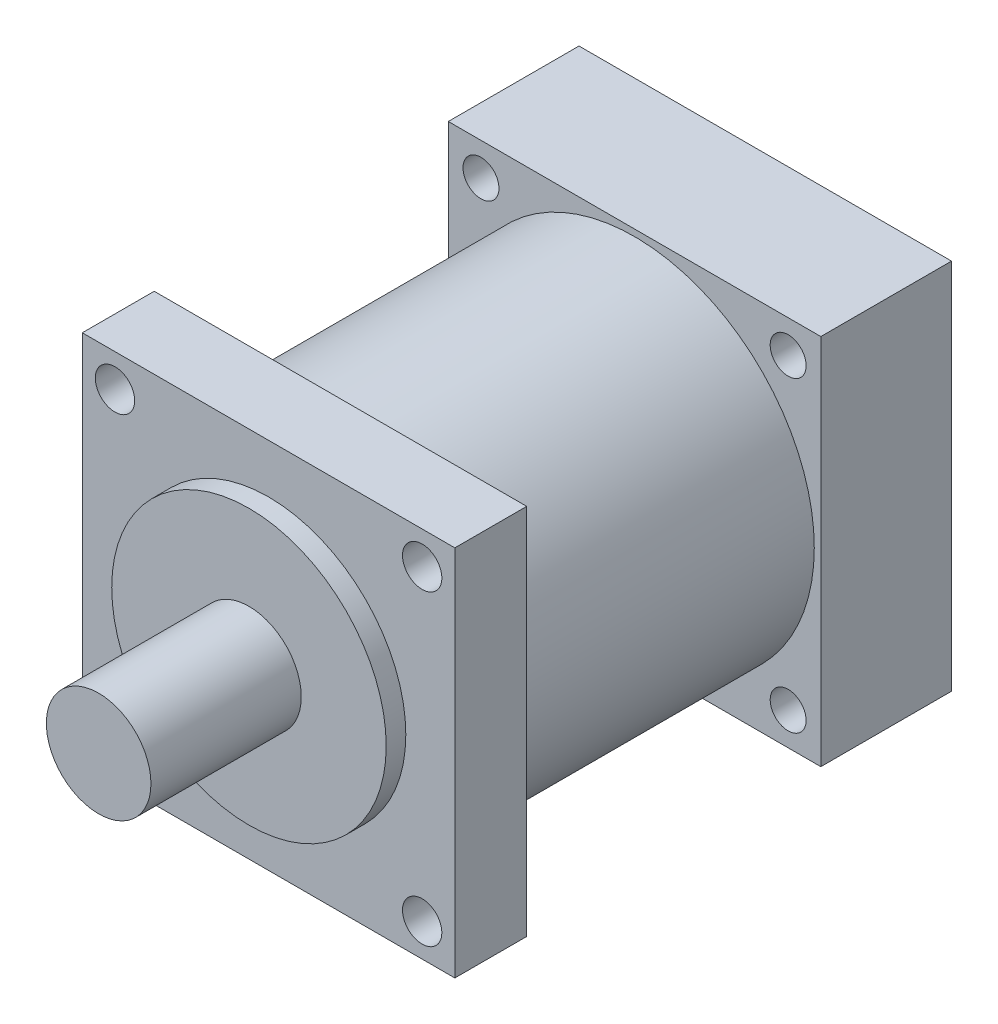
ISO-10303-21;
HEADER;
FILE_DESCRIPTION(('STEP AP214'),'2;1');
FILE_NAME('part.step','',(''),(''),'','','');
FILE_SCHEMA(('AUTOMOTIVE_DESIGN { 1 0 10303 214 1 1 1 1 }'));
ENDSEC;
DATA;
#1=APPLICATION_CONTEXT('core data for automotive mechanical design processes');
#2=APPLICATION_PROTOCOL_DEFINITION('international standard','automotive_design',2000,#1);
#3=PRODUCT_CONTEXT('',#1,'mechanical');
#4=PRODUCT('Part','Part','',(#3));
#5=PRODUCT_RELATED_PRODUCT_CATEGORY('part','',(#4));
#6=PRODUCT_DEFINITION_FORMATION('','',#4);
#7=PRODUCT_DEFINITION_CONTEXT('part definition',#1,'design');
#8=PRODUCT_DEFINITION('design','',#6,#7);
#9=PRODUCT_DEFINITION_SHAPE('','',#8);
#10=(LENGTH_UNIT() NAMED_UNIT(*) SI_UNIT(.MILLI.,.METRE.));
#11=(NAMED_UNIT(*) PLANE_ANGLE_UNIT() SI_UNIT($,.RADIAN.));
#12=(NAMED_UNIT(*) SI_UNIT($,.STERADIAN.) SOLID_ANGLE_UNIT());
#13=UNCERTAINTY_MEASURE_WITH_UNIT(LENGTH_MEASURE(1.E-05),#10,'distance_accuracy_value','');
#14=(GEOMETRIC_REPRESENTATION_CONTEXT(3) GLOBAL_UNCERTAINTY_ASSIGNED_CONTEXT((#13)) GLOBAL_UNIT_ASSIGNED_CONTEXT((#10,
#11,#12)) REPRESENTATION_CONTEXT('',''));
#15=CARTESIAN_POINT('',(0.,0.,0.));
#16=DIRECTION('',(0.,0.,1.));
#17=DIRECTION('',(1.,0.,0.));
#18=AXIS2_PLACEMENT_3D('',#15,#16,#17);
#19=CARTESIAN_POINT('',(0.,0.,11.));
#20=DIRECTION('',(0.,0.,1.));
#21=DIRECTION('',(1.,0.,0.));
#22=AXIS2_PLACEMENT_3D('',#19,#20,#21);
#23=PLANE('',#22);
#24=CARTESIAN_POINT('',(4.99675324675326,11.7516233766234,11.));
#25=DIRECTION('',(0.,0.,1.));
#26=DIRECTION('',(1.,0.,0.));
#27=AXIS2_PLACEMENT_3D('',#24,#25,#26);
#28=CIRCLE('',#27,21.);
#29=CARTESIAN_POINT('',(25.9967532467533,11.7516233766234,11.));
#30=VERTEX_POINT('',#29);
#31=EDGE_CURVE('E150',#30,#30,#28,.T.);
#32=ORIENTED_EDGE('',*,*,#31,.F.);
#33=EDGE_LOOP('',(#32));
#34=FACE_BOUND('',#33,.T.);
#35=CARTESIAN_POINT('',(-18.5032467532467,-11.7483766233766,11.));
#36=DIRECTION('',(0.,0.,1.));
#37=DIRECTION('',(-1.,0.,0.));
#38=AXIS2_PLACEMENT_3D('',#35,#36,#37);
#39=CIRCLE('',#38,3.0101369019199);
#40=CARTESIAN_POINT('',(-21.5133836551666,-11.7483766233766,11.));
#41=VERTEX_POINT('',#40);
#42=EDGE_CURVE('E165',#41,#41,#39,.T.);
#43=ORIENTED_EDGE('',*,*,#42,.F.);
#44=EDGE_LOOP('',(#43));
#45=FACE_BOUND('',#44,.T.);
#46=CARTESIAN_POINT('',(-18.5032467532467,35.2516233766234,11.));
#47=DIRECTION('',(0.,0.,1.));
#48=DIRECTION('',(1.,0.,0.));
#49=AXIS2_PLACEMENT_3D('',#46,#47,#48);
#50=CIRCLE('',#49,3.0101369019199);
#51=CARTESIAN_POINT('',(-15.4931098513268,35.2516233766234,11.));
#52=VERTEX_POINT('',#51);
#53=EDGE_CURVE('E177',#52,#52,#50,.T.);
#54=ORIENTED_EDGE('',*,*,#53,.F.);
#55=EDGE_LOOP('',(#54));
#56=FACE_BOUND('',#55,.T.);
#57=DIRECTION('',(0.,-1.,0.));
#58=VECTOR('',#57,1.);
#59=CARTESIAN_POINT('',(-23.5032467532468,40.2516233766234,11.));
#60=LINE('',#59,#58);
#61=CARTESIAN_POINT('',(-23.5032467532468,40.2516233766234,11.));
#62=VERTEX_POINT('',#61);
#63=CARTESIAN_POINT('',(-23.5032467532467,-16.7483766233766,11.));
#64=VERTEX_POINT('',#63);
#65=EDGE_CURVE('E183',#62,#64,#60,.T.);
#66=ORIENTED_EDGE('',*,*,#65,.T.);
#67=DIRECTION('',(1.,0.,0.));
#68=VECTOR('',#67,1.);
#69=CARTESIAN_POINT('',(-23.5032467532467,-16.7483766233766,11.));
#70=LINE('',#69,#68);
#71=CARTESIAN_POINT('',(33.4967532467533,-16.7483766233766,11.));
#72=VERTEX_POINT('',#71);
#73=EDGE_CURVE('E86',#64,#72,#70,.T.);
#74=ORIENTED_EDGE('',*,*,#73,.T.);
#75=DIRECTION('',(0.,1.,0.));
#76=VECTOR('',#75,1.);
#77=CARTESIAN_POINT('',(33.4967532467533,40.2516233766234,11.));
#78=LINE('',#77,#76);
#79=CARTESIAN_POINT('',(33.4967532467533,40.2516233766234,11.));
#80=VERTEX_POINT('',#79);
#81=EDGE_CURVE('E186',#72,#80,#78,.T.);
#82=ORIENTED_EDGE('',*,*,#81,.T.);
#83=DIRECTION('',(-1.,0.,0.));
#84=VECTOR('',#83,1.);
#85=CARTESIAN_POINT('',(-23.5032467532468,40.2516233766234,11.));
#86=LINE('',#85,#84);
#87=EDGE_CURVE('E54',#80,#62,#86,.T.);
#88=ORIENTED_EDGE('',*,*,#87,.T.);
#89=EDGE_LOOP('',(#66,#74,#82,#88));
#90=FACE_BOUND('',#89,.T.);
#91=CARTESIAN_POINT('',(28.4967532467533,35.2516233766234,11.));
#92=DIRECTION('',(0.,0.,1.));
#93=DIRECTION('',(-1.,0.,0.));
#94=AXIS2_PLACEMENT_3D('',#91,#92,#93);
#95=CIRCLE('',#94,3.01013690191991);
#96=CARTESIAN_POINT('',(25.4866163448333,35.2516233766234,11.));
#97=VERTEX_POINT('',#96);
#98=EDGE_CURVE('E171',#97,#97,#95,.T.);
#99=ORIENTED_EDGE('',*,*,#98,.F.);
#100=EDGE_LOOP('',(#99));
#101=FACE_BOUND('',#100,.T.);
#102=CARTESIAN_POINT('',(28.4967532467532,-11.7483766233766,11.));
#103=DIRECTION('',(0.,0.,1.));
#104=DIRECTION('',(1.,0.,0.));
#105=AXIS2_PLACEMENT_3D('',#102,#103,#104);
#106=CIRCLE('',#105,3.01013690191991);
#107=CARTESIAN_POINT('',(31.5068901486731,-11.7483766233766,11.));
#108=VERTEX_POINT('',#107);
#109=EDGE_CURVE('E159',#108,#108,#106,.T.);
#110=ORIENTED_EDGE('',*,*,#109,.F.);
#111=EDGE_LOOP('',(#110));
#112=FACE_BOUND('',#111,.T.);
#113=ADVANCED_FACE('F35',(#34,#45,#56,#90,#101,#112),#23,.T.);
#114=CARTESIAN_POINT('',(0.,0.,0.));
#115=DIRECTION('',(0.,0.,1.));
#116=DIRECTION('',(1.,0.,0.));
#117=AXIS2_PLACEMENT_3D('',#114,#115,#116);
#118=PLANE('',#117);
#119=CARTESIAN_POINT('',(4.99675324675326,11.7516233766234,0.));
#120=DIRECTION('',(0.,0.,1.));
#121=DIRECTION('',(1.,0.,0.));
#122=AXIS2_PLACEMENT_3D('',#119,#120,#121);
#123=CIRCLE('',#122,27.5);
#124=CARTESIAN_POINT('',(32.4967532467533,11.7516233766234,0.));
#125=VERTEX_POINT('',#124);
#126=EDGE_CURVE('E11',#125,#125,#123,.F.);
#127=ORIENTED_EDGE('',*,*,#126,.F.);
#128=EDGE_LOOP('',(#127));
#129=FACE_BOUND('',#128,.T.);
#130=DIRECTION('',(0.,-1.,0.));
#131=VECTOR('',#130,1.);
#132=CARTESIAN_POINT('',(-23.5032467532468,40.2516233766234,0.));
#133=LINE('',#132,#131);
#134=CARTESIAN_POINT('',(-23.5032467532468,40.2516233766234,0.));
#135=VERTEX_POINT('',#134);
#136=CARTESIAN_POINT('',(-23.5032467532467,-16.7483766233766,0.));
#137=VERTEX_POINT('',#136);
#138=EDGE_CURVE('E180',#135,#137,#133,.T.);
#139=ORIENTED_EDGE('',*,*,#138,.F.);
#140=DIRECTION('',(-1.,0.,0.));
#141=VECTOR('',#140,1.);
#142=CARTESIAN_POINT('',(-23.5032467532468,40.2516233766234,0.));
#143=LINE('',#142,#141);
#144=CARTESIAN_POINT('',(33.4967532467533,40.2516233766234,0.));
#145=VERTEX_POINT('',#144);
#146=EDGE_CURVE('E78',#145,#135,#143,.T.);
#147=ORIENTED_EDGE('',*,*,#146,.F.);
#148=DIRECTION('',(0.,1.,0.));
#149=VECTOR('',#148,1.);
#150=CARTESIAN_POINT('',(33.4967532467533,40.2516233766234,0.));
#151=LINE('',#150,#149);
#152=CARTESIAN_POINT('',(33.4967532467533,-16.7483766233766,0.));
#153=VERTEX_POINT('',#152);
#154=EDGE_CURVE('E72',#153,#145,#151,.T.);
#155=ORIENTED_EDGE('',*,*,#154,.F.);
#156=DIRECTION('',(1.,0.,0.));
#157=VECTOR('',#156,1.);
#158=CARTESIAN_POINT('',(-23.5032467532467,-16.7483766233766,0.));
#159=LINE('',#158,#157);
#160=EDGE_CURVE('E192',#137,#153,#159,.T.);
#161=ORIENTED_EDGE('',*,*,#160,.F.);
#162=EDGE_LOOP('',(#139,#147,#155,#161));
#163=FACE_BOUND('',#162,.T.);
#164=CARTESIAN_POINT('',(-18.5032467532467,35.2516233766234,0.));
#165=DIRECTION('',(0.,0.,1.));
#166=DIRECTION('',(1.,0.,0.));
#167=AXIS2_PLACEMENT_3D('',#164,#165,#166);
#168=CIRCLE('',#167,3.0101369019199);
#169=CARTESIAN_POINT('',(-15.4931098513268,35.2516233766234,0.));
#170=VERTEX_POINT('',#169);
#171=EDGE_CURVE('E174',#170,#170,#168,.T.);
#172=ORIENTED_EDGE('',*,*,#171,.T.);
#173=EDGE_LOOP('',(#172));
#174=FACE_BOUND('',#173,.T.);
#175=CARTESIAN_POINT('',(28.4967532467533,35.2516233766234,0.));
#176=DIRECTION('',(0.,0.,1.));
#177=DIRECTION('',(-1.,0.,0.));
#178=AXIS2_PLACEMENT_3D('',#175,#176,#177);
#179=CIRCLE('',#178,3.01013690191991);
#180=CARTESIAN_POINT('',(25.4866163448333,35.2516233766234,0.));
#181=VERTEX_POINT('',#180);
#182=EDGE_CURVE('E168',#181,#181,#179,.T.);
#183=ORIENTED_EDGE('',*,*,#182,.T.);
#184=EDGE_LOOP('',(#183));
#185=FACE_BOUND('',#184,.T.);
#186=CARTESIAN_POINT('',(-18.5032467532467,-11.7483766233766,0.));
#187=DIRECTION('',(0.,0.,1.));
#188=DIRECTION('',(-1.,0.,0.));
#189=AXIS2_PLACEMENT_3D('',#186,#187,#188);
#190=CIRCLE('',#189,3.0101369019199);
#191=CARTESIAN_POINT('',(-21.5133836551666,-11.7483766233766,0.));
#192=VERTEX_POINT('',#191);
#193=EDGE_CURVE('E162',#192,#192,#190,.T.);
#194=ORIENTED_EDGE('',*,*,#193,.T.);
#195=EDGE_LOOP('',(#194));
#196=FACE_BOUND('',#195,.T.);
#197=CARTESIAN_POINT('',(28.4967532467532,-11.7483766233766,0.));
#198=DIRECTION('',(0.,0.,1.));
#199=DIRECTION('',(1.,0.,0.));
#200=AXIS2_PLACEMENT_3D('',#197,#198,#199);
#201=CIRCLE('',#200,3.01013690191991);
#202=CARTESIAN_POINT('',(31.5068901486731,-11.7483766233766,0.));
#203=VERTEX_POINT('',#202);
#204=EDGE_CURVE('E156',#203,#203,#201,.T.);
#205=ORIENTED_EDGE('',*,*,#204,.T.);
#206=EDGE_LOOP('',(#205));
#207=FACE_BOUND('',#206,.T.);
#208=ADVANCED_FACE('F252',(#129,#163,#174,#185,#196,#207),#118,.F.);
#209=CARTESIAN_POINT('',(-23.5032467532468,40.2516233766234,11.));
#210=DIRECTION('',(1.,0.,0.));
#211=DIRECTION('',(0.,1.,0.));
#212=AXIS2_PLACEMENT_3D('',#209,#210,#211);
#213=PLANE('',#212);
#214=ORIENTED_EDGE('',*,*,#138,.T.);
#215=DIRECTION('',(0.,0.,-1.));
#216=VECTOR('',#215,1.);
#217=CARTESIAN_POINT('',(-23.5032467532467,-16.7483766233766,11.));
#218=LINE('',#217,#216);
#219=EDGE_CURVE('E45',#64,#137,#218,.T.);
#220=ORIENTED_EDGE('',*,*,#219,.F.);
#221=ORIENTED_EDGE('',*,*,#65,.F.);
#222=DIRECTION('',(0.,0.,-1.));
#223=VECTOR('',#222,1.);
#224=CARTESIAN_POINT('',(-23.5032467532468,40.2516233766234,11.));
#225=LINE('',#224,#223);
#226=EDGE_CURVE('E189',#62,#135,#225,.T.);
#227=ORIENTED_EDGE('',*,*,#226,.T.);
#228=EDGE_LOOP('',(#214,#220,#221,#227));
#229=FACE_BOUND('',#228,.T.);
#230=ADVANCED_FACE('F37',(#229),#213,.F.);
#231=CARTESIAN_POINT('',(-23.5032467532467,-16.7483766233766,11.));
#232=DIRECTION('',(0.,1.,0.));
#233=DIRECTION('',(0.,0.,1.));
#234=AXIS2_PLACEMENT_3D('',#231,#232,#233);
#235=PLANE('',#234);
#236=ORIENTED_EDGE('',*,*,#160,.T.);
#237=DIRECTION('',(0.,0.,-1.));
#238=VECTOR('',#237,1.);
#239=CARTESIAN_POINT('',(33.4967532467533,-16.7483766233766,11.));
#240=LINE('',#239,#238);
#241=EDGE_CURVE('E199',#72,#153,#240,.T.);
#242=ORIENTED_EDGE('',*,*,#241,.F.);
#243=ORIENTED_EDGE('',*,*,#73,.F.);
#244=ORIENTED_EDGE('',*,*,#219,.T.);
#245=EDGE_LOOP('',(#236,#242,#243,#244));
#246=FACE_BOUND('',#245,.T.);
#247=ADVANCED_FACE('F272',(#246),#235,.F.);
#248=CARTESIAN_POINT('',(33.4967532467533,40.2516233766234,11.));
#249=DIRECTION('',(-1.,0.,0.));
#250=DIRECTION('',(0.,0.,1.));
#251=AXIS2_PLACEMENT_3D('',#248,#249,#250);
#252=PLANE('',#251);
#253=ORIENTED_EDGE('',*,*,#154,.T.);
#254=DIRECTION('',(0.,0.,-1.));
#255=VECTOR('',#254,1.);
#256=CARTESIAN_POINT('',(33.4967532467533,40.2516233766234,11.));
#257=LINE('',#256,#255);
#258=EDGE_CURVE('E197',#80,#145,#257,.T.);
#259=ORIENTED_EDGE('',*,*,#258,.F.);
#260=ORIENTED_EDGE('',*,*,#81,.F.);
#261=ORIENTED_EDGE('',*,*,#241,.T.);
#262=EDGE_LOOP('',(#253,#259,#260,#261));
#263=FACE_BOUND('',#262,.T.);
#264=ADVANCED_FACE('F270',(#263),#252,.F.);
#265=CARTESIAN_POINT('',(-23.5032467532468,40.2516233766234,11.));
#266=DIRECTION('',(0.,-1.,0.));
#267=DIRECTION('',(0.,0.,-1.));
#268=AXIS2_PLACEMENT_3D('',#265,#266,#267);
#269=PLANE('',#268);
#270=ORIENTED_EDGE('',*,*,#146,.T.);
#271=ORIENTED_EDGE('',*,*,#226,.F.);
#272=ORIENTED_EDGE('',*,*,#87,.F.);
#273=ORIENTED_EDGE('',*,*,#258,.T.);
#274=EDGE_LOOP('',(#270,#271,#272,#273));
#275=FACE_BOUND('',#274,.T.);
#276=ADVANCED_FACE('F267',(#275),#269,.F.);
#277=CARTESIAN_POINT('',(-18.5032467532467,35.2516233766234,11.));
#278=DIRECTION('',(0.,0.,-1.));
#279=DIRECTION('',(-1.,0.,0.));
#280=AXIS2_PLACEMENT_3D('',#277,#278,#279);
#281=CYLINDRICAL_SURFACE('',#280,3.0101369019199);
#282=ORIENTED_EDGE('',*,*,#53,.T.);
#283=EDGE_LOOP('',(#282));
#284=FACE_BOUND('',#283,.T.);
#285=ORIENTED_EDGE('',*,*,#171,.F.);
#286=EDGE_LOOP('',(#285));
#287=FACE_BOUND('',#286,.T.);
#288=ADVANCED_FACE('F264',(#284,#287),#281,.F.);
#289=CARTESIAN_POINT('',(28.4967532467533,35.2516233766234,11.));
#290=DIRECTION('',(0.,0.,-1.));
#291=DIRECTION('',(-1.,0.,0.));
#292=AXIS2_PLACEMENT_3D('',#289,#290,#291);
#293=CYLINDRICAL_SURFACE('',#292,3.01013690191991);
#294=ORIENTED_EDGE('',*,*,#98,.T.);
#295=EDGE_LOOP('',(#294));
#296=FACE_BOUND('',#295,.T.);
#297=ORIENTED_EDGE('',*,*,#182,.F.);
#298=EDGE_LOOP('',(#297));
#299=FACE_BOUND('',#298,.T.);
#300=ADVANCED_FACE('F304',(#296,#299),#293,.F.);
#301=CARTESIAN_POINT('',(-18.5032467532467,-11.7483766233766,11.));
#302=DIRECTION('',(0.,0.,-1.));
#303=DIRECTION('',(-1.,0.,0.));
#304=AXIS2_PLACEMENT_3D('',#301,#302,#303);
#305=CYLINDRICAL_SURFACE('',#304,3.0101369019199);
#306=ORIENTED_EDGE('',*,*,#42,.T.);
#307=EDGE_LOOP('',(#306));
#308=FACE_BOUND('',#307,.T.);
#309=ORIENTED_EDGE('',*,*,#193,.F.);
#310=EDGE_LOOP('',(#309));
#311=FACE_BOUND('',#310,.T.);
#312=ADVANCED_FACE('F293',(#308,#311),#305,.F.);
#313=CARTESIAN_POINT('',(28.4967532467532,-11.7483766233766,11.));
#314=DIRECTION('',(0.,0.,-1.));
#315=DIRECTION('',(-1.,0.,0.));
#316=AXIS2_PLACEMENT_3D('',#313,#314,#315);
#317=CYLINDRICAL_SURFACE('',#316,3.01013690191991);
#318=ORIENTED_EDGE('',*,*,#109,.T.);
#319=EDGE_LOOP('',(#318));
#320=FACE_BOUND('',#319,.T.);
#321=ORIENTED_EDGE('',*,*,#204,.F.);
#322=EDGE_LOOP('',(#321));
#323=FACE_BOUND('',#322,.T.);
#324=ADVANCED_FACE('F289',(#320,#323),#317,.F.);
#325=CARTESIAN_POINT('',(4.99675324675326,11.7516233766234,14.));
#326=DIRECTION('',(0.,0.,-1.));
#327=DIRECTION('',(-1.,0.,0.));
#328=AXIS2_PLACEMENT_3D('',#325,#326,#327);
#329=CYLINDRICAL_SURFACE('',#328,21.);
#330=CARTESIAN_POINT('',(4.99675324675326,11.7516233766234,14.));
#331=DIRECTION('',(0.,0.,1.));
#332=DIRECTION('',(1.,0.,0.));
#333=AXIS2_PLACEMENT_3D('',#330,#331,#332);
#334=CIRCLE('',#333,21.);
#335=CARTESIAN_POINT('',(25.9967532467533,11.7516233766234,14.));
#336=VERTEX_POINT('',#335);
#337=EDGE_CURVE('E153',#336,#336,#334,.T.);
#338=ORIENTED_EDGE('',*,*,#337,.F.);
#339=EDGE_LOOP('',(#338));
#340=FACE_BOUND('',#339,.T.);
#341=ORIENTED_EDGE('',*,*,#31,.T.);
#342=EDGE_LOOP('',(#341));
#343=FACE_BOUND('',#342,.T.);
#344=ADVANCED_FACE('F292',(#340,#343),#329,.T.);
#345=CARTESIAN_POINT('',(4.99675324675326,11.7516233766234,14.));
#346=DIRECTION('',(0.,0.,1.));
#347=DIRECTION('',(1.,0.,0.));
#348=AXIS2_PLACEMENT_3D('',#345,#346,#347);
#349=PLANE('',#348);
#350=CARTESIAN_POINT('',(4.99675324675326,11.7516233766234,14.));
#351=DIRECTION('',(0.,0.,1.));
#352=DIRECTION('',(1.,0.,0.));
#353=AXIS2_PLACEMENT_3D('',#350,#351,#352);
#354=CIRCLE('',#353,8.);
#355=CARTESIAN_POINT('',(12.9967532467533,11.7516233766234,14.));
#356=VERTEX_POINT('',#355);
#357=EDGE_CURVE('E141',#356,#356,#354,.T.);
#358=ORIENTED_EDGE('',*,*,#357,.F.);
#359=EDGE_LOOP('',(#358));
#360=FACE_BOUND('',#359,.T.);
#361=ORIENTED_EDGE('',*,*,#337,.T.);
#362=EDGE_LOOP('',(#361));
#363=FACE_BOUND('',#362,.T.);
#364=ADVANCED_FACE('F301',(#360,#363),#349,.T.);
#365=CARTESIAN_POINT('',(4.99675324675326,11.7516233766234,37.));
#366=DIRECTION('',(0.,0.,-1.));
#367=DIRECTION('',(-1.,0.,0.));
#368=AXIS2_PLACEMENT_3D('',#365,#366,#367);
#369=CYLINDRICAL_SURFACE('',#368,8.);
#370=CARTESIAN_POINT('',(4.99675324675326,11.7516233766234,37.));
#371=DIRECTION('',(0.,0.,1.));
#372=DIRECTION('',(1.,0.,0.));
#373=AXIS2_PLACEMENT_3D('',#370,#371,#372);
#374=CIRCLE('',#373,8.);
#375=CARTESIAN_POINT('',(12.9967532467533,11.7516233766234,37.));
#376=VERTEX_POINT('',#375);
#377=EDGE_CURVE('E147',#376,#376,#374,.T.);
#378=ORIENTED_EDGE('',*,*,#377,.F.);
#379=EDGE_LOOP('',(#378));
#380=FACE_BOUND('',#379,.T.);
#381=ORIENTED_EDGE('',*,*,#357,.T.);
#382=EDGE_LOOP('',(#381));
#383=FACE_BOUND('',#382,.T.);
#384=ADVANCED_FACE('F505',(#380,#383),#369,.T.);
#385=CARTESIAN_POINT('',(4.99675324675326,11.7516233766234,37.));
#386=DIRECTION('',(0.,0.,1.));
#387=DIRECTION('',(1.,0.,0.));
#388=AXIS2_PLACEMENT_3D('',#385,#386,#387);
#389=PLANE('',#388);
#390=ORIENTED_EDGE('',*,*,#377,.T.);
#391=EDGE_LOOP('',(#390));
#392=FACE_BOUND('',#391,.T.);
#393=ADVANCED_FACE('F356',(#392),#389,.T.);
#394=CARTESIAN_POINT('',(4.99675324675326,11.7516233766234,-45.));
#395=DIRECTION('',(0.,0.,1.));
#396=DIRECTION('',(1.,0.,0.));
#397=AXIS2_PLACEMENT_3D('',#394,#395,#396);
#398=CYLINDRICAL_SURFACE('',#397,27.5);
#399=CARTESIAN_POINT('',(4.99675324675326,11.7516233766234,-45.));
#400=DIRECTION('',(0.,0.,-1.));
#401=DIRECTION('',(-1.,0.,0.));
#402=AXIS2_PLACEMENT_3D('',#399,#400,#401);
#403=CIRCLE('',#402,27.5);
#404=CARTESIAN_POINT('',(32.4967532467533,11.7516233766234,-45.));
#405=VERTEX_POINT('',#404);
#406=EDGE_CURVE('E138',#405,#405,#403,.T.);
#407=CARTESIAN_POINT('',(32.4967532467533,11.7516233766234,-45.));
#408=CARTESIAN_POINT('',(32.4967532467533,11.7516233766234,-44.53125));
#409=CARTESIAN_POINT('',(32.4967532467533,11.7516233766234,-44.0625));
#410=CARTESIAN_POINT('',(32.4967532467533,11.7516233766234,-43.125));
#411=CARTESIAN_POINT('',(32.4967532467533,11.7516233766234,-42.65625));
#412=CARTESIAN_POINT('',(32.4967532467533,11.7516233766234,-41.71875));
#413=CARTESIAN_POINT('',(32.4967532467533,11.7516233766234,-41.25));
#414=CARTESIAN_POINT('',(32.4967532467533,11.7516233766234,-40.3125));
#415=CARTESIAN_POINT('',(32.4967532467533,11.7516233766234,-39.84375));
#416=CARTESIAN_POINT('',(32.4967532467533,11.7516233766234,-38.90625));
#417=CARTESIAN_POINT('',(32.4967532467533,11.7516233766234,-38.4375));
#418=CARTESIAN_POINT('',(32.4967532467533,11.7516233766234,-37.5));
#419=CARTESIAN_POINT('',(32.4967532467533,11.7516233766234,-37.03125));
#420=CARTESIAN_POINT('',(32.4967532467533,11.7516233766234,-36.09375));
#421=CARTESIAN_POINT('',(32.4967532467533,11.7516233766234,-35.625));
#422=CARTESIAN_POINT('',(32.4967532467533,11.7516233766234,-34.6875));
#423=CARTESIAN_POINT('',(32.4967532467533,11.7516233766234,-34.21875));
#424=CARTESIAN_POINT('',(32.4967532467533,11.7516233766234,-33.28125));
#425=CARTESIAN_POINT('',(32.4967532467533,11.7516233766234,-32.8125));
#426=CARTESIAN_POINT('',(32.4967532467533,11.7516233766234,-31.875));
#427=CARTESIAN_POINT('',(32.4967532467533,11.7516233766234,-31.40625));
#428=CARTESIAN_POINT('',(32.4967532467533,11.7516233766234,-30.46875));
#429=CARTESIAN_POINT('',(32.4967532467533,11.7516233766234,-30.));
#430=CARTESIAN_POINT('',(32.4967532467533,11.7516233766234,-29.0625));
#431=CARTESIAN_POINT('',(32.4967532467533,11.7516233766234,-28.59375));
#432=CARTESIAN_POINT('',(32.4967532467533,11.7516233766234,-27.65625));
#433=CARTESIAN_POINT('',(32.4967532467533,11.7516233766234,-27.1875));
#434=CARTESIAN_POINT('',(32.4967532467533,11.7516233766234,-26.25));
#435=CARTESIAN_POINT('',(32.4967532467533,11.7516233766234,-25.78125));
#436=CARTESIAN_POINT('',(32.4967532467533,11.7516233766234,-24.84375));
#437=CARTESIAN_POINT('',(32.4967532467533,11.7516233766234,-24.375));
#438=CARTESIAN_POINT('',(32.4967532467533,11.7516233766234,-23.4375));
#439=CARTESIAN_POINT('',(32.4967532467533,11.7516233766234,-22.96875));
#440=CARTESIAN_POINT('',(32.4967532467533,11.7516233766234,-22.03125));
#441=CARTESIAN_POINT('',(32.4967532467533,11.7516233766234,-21.5625));
#442=CARTESIAN_POINT('',(32.4967532467533,11.7516233766234,-20.625));
#443=CARTESIAN_POINT('',(32.4967532467533,11.7516233766234,-20.15625));
#444=CARTESIAN_POINT('',(32.4967532467533,11.7516233766234,-19.21875));
#445=CARTESIAN_POINT('',(32.4967532467533,11.7516233766234,-18.75));
#446=CARTESIAN_POINT('',(32.4967532467533,11.7516233766234,-17.8125));
#447=CARTESIAN_POINT('',(32.4967532467533,11.7516233766234,-17.34375));
#448=CARTESIAN_POINT('',(32.4967532467533,11.7516233766234,-16.40625));
#449=CARTESIAN_POINT('',(32.4967532467533,11.7516233766234,-15.9375));
#450=CARTESIAN_POINT('',(32.4967532467533,11.7516233766234,-15.));
#451=CARTESIAN_POINT('',(32.4967532467533,11.7516233766234,-14.53125));
#452=CARTESIAN_POINT('',(32.4967532467533,11.7516233766234,-13.59375));
#453=CARTESIAN_POINT('',(32.4967532467533,11.7516233766234,-13.125));
#454=CARTESIAN_POINT('',(32.4967532467533,11.7516233766234,-12.1875));
#455=CARTESIAN_POINT('',(32.4967532467533,11.7516233766234,-11.71875));
#456=CARTESIAN_POINT('',(32.4967532467533,11.7516233766234,-10.78125));
#457=CARTESIAN_POINT('',(32.4967532467533,11.7516233766234,-10.3125));
#458=CARTESIAN_POINT('',(32.4967532467533,11.7516233766234,-9.37500000000001));
#459=CARTESIAN_POINT('',(32.4967532467533,11.7516233766234,-8.90625000000001));
#460=CARTESIAN_POINT('',(32.4967532467533,11.7516233766234,-7.96875000000001));
#461=CARTESIAN_POINT('',(32.4967532467533,11.7516233766234,-7.5));
#462=CARTESIAN_POINT('',(32.4967532467533,11.7516233766234,-6.5625));
#463=CARTESIAN_POINT('',(32.4967532467533,11.7516233766234,-6.09375));
#464=CARTESIAN_POINT('',(32.4967532467533,11.7516233766234,-5.15625000000001));
#465=CARTESIAN_POINT('',(32.4967532467533,11.7516233766234,-4.68750000000001));
#466=CARTESIAN_POINT('',(32.4967532467533,11.7516233766234,-3.75000000000001));
#467=CARTESIAN_POINT('',(32.4967532467533,11.7516233766234,-3.28125000000001));
#468=CARTESIAN_POINT('',(32.4967532467533,11.7516233766234,-2.34375000000001));
#469=CARTESIAN_POINT('',(32.4967532467533,11.7516233766234,-1.87500000000001));
#470=CARTESIAN_POINT('',(32.4967532467533,11.7516233766234,-0.937500000000006));
#471=CARTESIAN_POINT('',(32.4967532467533,11.7516233766234,-0.468750000000007));
#472=CARTESIAN_POINT('',(32.4967532467533,11.7516233766234,0.));
#473=B_SPLINE_CURVE_WITH_KNOTS('',3,(#407,#408,#409,#410,#411,#412,#413,#414,#415,#416,#417,
#418,#419,#420,#421,#422,#423,#424,#425,#426,#427,#428,#429,#430,#431,#432,#433,#434,#435,#436,
#437,#438,#439,#440,#441,#442,#443,#444,#445,#446,#447,#448,#449,#450,#451,#452,#453,#454,#455,
#456,#457,#458,#459,#460,#461,#462,#463,#464,#465,#466,#467,#468,#469,#470,#471,#472),
.UNSPECIFIED.,.F.,.F.,(4,2,2,2,2,2,2,2,2,2,2,2,2,2,2,2,2,2,2,2,2,2,2,2,2,2,2,2,2,2,2,2,4),(0.,
1.40625,2.8125,4.21874999999999,5.625,7.03125,8.43749999999999,9.84374999999999,11.25,12.65625,
14.0625,15.46875,16.875,18.28125,19.6875,21.09375,22.5,23.90625,25.3125,26.71875,28.125,
29.53125,30.9375,32.34375,33.75,35.15625,36.5625,37.96875,39.375,40.78125,42.1875,43.59375,45.),.UNSPECIFIED.);
#474=EDGE_CURVE('BSEAM361',#405,#125,#473,.T.);
#475=ORIENTED_EDGE('',*,*,#406,.F.);
#476=ORIENTED_EDGE('',*,*,#126,.T.);
#477=ORIENTED_EDGE('',*,*,#474,.T.);
#478=ORIENTED_EDGE('',*,*,#474,.F.);
#479=EDGE_LOOP('',(#475,#477,#476,#478));
#480=FACE_BOUND('',#479,.T.);
#481=ADVANCED_FACE('F361',(#480),#398,.T.);
#482=CARTESIAN_POINT('',(-23.5032467532467,-16.7483766233766,-65.));
#483=DIRECTION('',(1.,0.,0.));
#484=DIRECTION('',(0.,0.,-1.));
#485=AXIS2_PLACEMENT_3D('',#482,#483,#484);
#486=PLANE('',#485);
#487=DIRECTION('',(0.,1.,0.));
#488=VECTOR('',#487,1.);
#489=CARTESIAN_POINT('',(-23.5032467532467,-16.7483766233766,-45.));
#490=LINE('',#489,#488);
#491=CARTESIAN_POINT('',(-23.5032467532467,-16.7483766233766,-45.));
#492=VERTEX_POINT('',#491);
#493=CARTESIAN_POINT('',(-23.5032467532467,40.2516233766234,-45.));
#494=VERTEX_POINT('',#493);
#495=EDGE_CURVE('E137',#492,#494,#490,.T.);
#496=ORIENTED_EDGE('',*,*,#495,.T.);
#497=DIRECTION('',(0.,0.,1.));
#498=VECTOR('',#497,1.);
#499=CARTESIAN_POINT('',(-23.5032467532467,40.2516233766234,-65.));
#500=LINE('',#499,#498);
#501=CARTESIAN_POINT('',(-23.5032467532467,40.2516233766234,-65.));
#502=VERTEX_POINT('',#501);
#503=EDGE_CURVE('E117',#502,#494,#500,.T.);
#504=ORIENTED_EDGE('',*,*,#503,.F.);
#505=DIRECTION('',(0.,1.,0.));
#506=VECTOR('',#505,1.);
#507=CARTESIAN_POINT('',(-23.5032467532467,-16.7483766233766,-65.));
#508=LINE('',#507,#506);
#509=CARTESIAN_POINT('',(-23.5032467532467,-16.7483766233766,-65.));
#510=VERTEX_POINT('',#509);
#511=EDGE_CURVE('E124',#510,#502,#508,.T.);
#512=ORIENTED_EDGE('',*,*,#511,.F.);
#513=DIRECTION('',(0.,0.,1.));
#514=VECTOR('',#513,1.);
#515=CARTESIAN_POINT('',(-23.5032467532467,-16.7483766233766,-65.));
#516=LINE('',#515,#514);
#517=EDGE_CURVE('E226',#510,#492,#516,.T.);
#518=ORIENTED_EDGE('',*,*,#517,.T.);
#519=EDGE_LOOP('',(#496,#504,#512,#518));
#520=FACE_BOUND('',#519,.T.);
#521=ADVANCED_FACE('F135',(#520),#486,.F.);
#522=CARTESIAN_POINT('',(33.4967532467533,40.2516233766234,-65.));
#523=DIRECTION('',(0.,-1.,0.));
#524=DIRECTION('',(0.,0.,-1.));
#525=AXIS2_PLACEMENT_3D('',#522,#523,#524);
#526=PLANE('',#525);
#527=DIRECTION('',(1.,0.,0.));
#528=VECTOR('',#527,1.);
#529=CARTESIAN_POINT('',(33.4967532467533,40.2516233766234,-45.));
#530=LINE('',#529,#528);
#531=CARTESIAN_POINT('',(33.4967532467533,40.2516233766234,-45.));
#532=VERTEX_POINT('',#531);
#533=EDGE_CURVE('E228',#494,#532,#530,.T.);
#534=ORIENTED_EDGE('',*,*,#533,.T.);
#535=DIRECTION('',(0.,0.,1.));
#536=VECTOR('',#535,1.);
#537=CARTESIAN_POINT('',(33.4967532467533,40.2516233766234,-65.));
#538=LINE('',#537,#536);
#539=CARTESIAN_POINT('',(33.4967532467533,40.2516233766234,-65.));
#540=VERTEX_POINT('',#539);
#541=EDGE_CURVE('E120',#540,#532,#538,.T.);
#542=ORIENTED_EDGE('',*,*,#541,.F.);
#543=DIRECTION('',(1.,0.,0.));
#544=VECTOR('',#543,1.);
#545=CARTESIAN_POINT('',(33.4967532467533,40.2516233766234,-65.));
#546=LINE('',#545,#544);
#547=EDGE_CURVE('E113',#502,#540,#546,.T.);
#548=ORIENTED_EDGE('',*,*,#547,.F.);
#549=ORIENTED_EDGE('',*,*,#503,.T.);
#550=EDGE_LOOP('',(#534,#542,#548,#549));
#551=FACE_BOUND('',#550,.T.);
#552=ADVANCED_FACE('F115',(#551),#526,.F.);
#553=CARTESIAN_POINT('',(33.4967532467533,-16.7483766233766,-65.));
#554=DIRECTION('',(-1.,0.,0.));
#555=DIRECTION('',(0.,0.,1.));
#556=AXIS2_PLACEMENT_3D('',#553,#554,#555);
#557=PLANE('',#556);
#558=DIRECTION('',(0.,-1.,0.));
#559=VECTOR('',#558,1.);
#560=CARTESIAN_POINT('',(33.4967532467533,-16.7483766233766,-45.));
#561=LINE('',#560,#559);
#562=CARTESIAN_POINT('',(33.4967532467533,-16.7483766233766,-45.));
#563=VERTEX_POINT('',#562);
#564=EDGE_CURVE('E230',#532,#563,#561,.T.);
#565=ORIENTED_EDGE('',*,*,#564,.T.);
#566=DIRECTION('',(0.,0.,1.));
#567=VECTOR('',#566,1.);
#568=CARTESIAN_POINT('',(33.4967532467533,-16.7483766233766,-65.));
#569=LINE('',#568,#567);
#570=CARTESIAN_POINT('',(33.4967532467533,-16.7483766233766,-65.));
#571=VERTEX_POINT('',#570);
#572=EDGE_CURVE('E143',#571,#563,#569,.T.);
#573=ORIENTED_EDGE('',*,*,#572,.F.);
#574=DIRECTION('',(0.,-1.,0.));
#575=VECTOR('',#574,1.);
#576=CARTESIAN_POINT('',(33.4967532467533,-16.7483766233766,-65.));
#577=LINE('',#576,#575);
#578=EDGE_CURVE('E123',#540,#571,#577,.T.);
#579=ORIENTED_EDGE('',*,*,#578,.F.);
#580=ORIENTED_EDGE('',*,*,#541,.T.);
#581=EDGE_LOOP('',(#565,#573,#579,#580));
#582=FACE_BOUND('',#581,.T.);
#583=ADVANCED_FACE('F242',(#582),#557,.F.);
#584=CARTESIAN_POINT('',(33.4967532467533,-16.7483766233766,-65.));
#585=DIRECTION('',(0.,1.,0.));
#586=DIRECTION('',(0.,0.,1.));
#587=AXIS2_PLACEMENT_3D('',#584,#585,#586);
#588=PLANE('',#587);
#589=DIRECTION('',(-1.,0.,0.));
#590=VECTOR('',#589,1.);
#591=CARTESIAN_POINT('',(33.4967532467533,-16.7483766233766,-45.));
#592=LINE('',#591,#590);
#593=EDGE_CURVE('E133',#563,#492,#592,.T.);
#594=ORIENTED_EDGE('',*,*,#593,.T.);
#595=ORIENTED_EDGE('',*,*,#517,.F.);
#596=DIRECTION('',(-1.,0.,0.));
#597=VECTOR('',#596,1.);
#598=CARTESIAN_POINT('',(33.4967532467533,-16.7483766233766,-65.));
#599=LINE('',#598,#597);
#600=EDGE_CURVE('E129',#571,#510,#599,.T.);
#601=ORIENTED_EDGE('',*,*,#600,.F.);
#602=ORIENTED_EDGE('',*,*,#572,.T.);
#603=EDGE_LOOP('',(#594,#595,#601,#602));
#604=FACE_BOUND('',#603,.T.);
#605=ADVANCED_FACE('F237',(#604),#588,.F.);
#606=CARTESIAN_POINT('',(0.,0.,-65.));
#607=DIRECTION('',(0.,0.,1.));
#608=DIRECTION('',(1.,0.,0.));
#609=AXIS2_PLACEMENT_3D('',#606,#607,#608);
#610=PLANE('',#609);
#611=CARTESIAN_POINT('',(4.99675324675326,11.7516233766234,-65.));
#612=DIRECTION('',(0.,0.,-1.));
#613=DIRECTION('',(-1.,0.,0.));
#614=AXIS2_PLACEMENT_3D('',#611,#612,#613);
#615=CIRCLE('',#614,22.0113765443206);
#616=CARTESIAN_POINT('',(-17.0146232975674,11.7516233766234,-65.));
#617=VERTEX_POINT('',#616);
#618=EDGE_CURVE('E473',#617,#617,#615,.T.);
#619=ORIENTED_EDGE('',*,*,#618,.F.);
#620=EDGE_LOOP('',(#619));
#621=FACE_BOUND('',#620,.T.);
#622=CARTESIAN_POINT('',(-18.5032467532467,35.2516233766234,-65.));
#623=DIRECTION('',(0.,0.,-1.));
#624=DIRECTION('',(1.,0.,0.));
#625=AXIS2_PLACEMENT_3D('',#622,#623,#624);
#626=CIRCLE('',#625,2.75);
#627=CARTESIAN_POINT('',(-15.7532467532467,35.2516233766234,-65.));
#628=VERTEX_POINT('',#627);
#629=EDGE_CURVE('E209',#628,#628,#626,.T.);
#630=ORIENTED_EDGE('',*,*,#629,.F.);
#631=EDGE_LOOP('',(#630));
#632=FACE_BOUND('',#631,.T.);
#633=CARTESIAN_POINT('',(-18.5032467532467,-11.7483766233767,-65.));
#634=DIRECTION('',(0.,0.,-1.));
#635=DIRECTION('',(1.,0.,0.));
#636=AXIS2_PLACEMENT_3D('',#633,#634,#635);
#637=CIRCLE('',#636,2.75);
#638=CARTESIAN_POINT('',(-15.7532467532467,-11.7483766233767,-65.));
#639=VERTEX_POINT('',#638);
#640=EDGE_CURVE('E476',#639,#639,#637,.T.);
#641=ORIENTED_EDGE('',*,*,#640,.F.);
#642=EDGE_LOOP('',(#641));
#643=FACE_BOUND('',#642,.T.);
#644=CARTESIAN_POINT('',(28.4967532467533,-11.7483766233766,-65.));
#645=DIRECTION('',(0.,0.,-1.));
#646=DIRECTION('',(-1.,0.,0.));
#647=AXIS2_PLACEMENT_3D('',#644,#645,#646);
#648=CIRCLE('',#647,2.75);
#649=CARTESIAN_POINT('',(25.7467532467532,-11.7483766233766,-65.));
#650=VERTEX_POINT('',#649);
#651=EDGE_CURVE('E221',#650,#650,#648,.T.);
#652=ORIENTED_EDGE('',*,*,#651,.F.);
#653=EDGE_LOOP('',(#652));
#654=FACE_BOUND('',#653,.T.);
#655=CARTESIAN_POINT('',(28.4967532467533,35.2516233766234,-65.));
#656=DIRECTION('',(0.,0.,-1.));
#657=DIRECTION('',(-1.,0.,0.));
#658=AXIS2_PLACEMENT_3D('',#655,#656,#657);
#659=CIRCLE('',#658,2.75);
#660=CARTESIAN_POINT('',(25.7467532467533,35.2516233766234,-65.));
#661=VERTEX_POINT('',#660);
#662=EDGE_CURVE('E205',#661,#661,#659,.T.);
#663=ORIENTED_EDGE('',*,*,#662,.F.);
#664=EDGE_LOOP('',(#663));
#665=FACE_BOUND('',#664,.T.);
#666=ORIENTED_EDGE('',*,*,#511,.T.);
#667=ORIENTED_EDGE('',*,*,#547,.T.);
#668=ORIENTED_EDGE('',*,*,#578,.T.);
#669=ORIENTED_EDGE('',*,*,#600,.T.);
#670=EDGE_LOOP('',(#666,#667,#668,#669));
#671=FACE_BOUND('',#670,.T.);
#672=ADVANCED_FACE('F127',(#621,#632,#643,#654,#665,#671),#610,.F.);
#673=CARTESIAN_POINT('',(0.,0.,-45.));
#674=DIRECTION('',(0.,0.,1.));
#675=DIRECTION('',(1.,0.,0.));
#676=AXIS2_PLACEMENT_3D('',#673,#674,#675);
#677=PLANE('',#676);
#678=CARTESIAN_POINT('',(-18.5032467532467,35.2516233766234,-45.));
#679=DIRECTION('',(0.,0.,1.));
#680=DIRECTION('',(1.,0.,0.));
#681=AXIS2_PLACEMENT_3D('',#678,#679,#680);
#682=CIRCLE('',#681,2.75);
#683=CARTESIAN_POINT('',(-15.7532467532467,35.2516233766234,-45.));
#684=VERTEX_POINT('',#683);
#685=EDGE_CURVE('E39',#684,#684,#682,.T.);
#686=ORIENTED_EDGE('',*,*,#685,.F.);
#687=EDGE_LOOP('',(#686));
#688=FACE_BOUND('',#687,.T.);
#689=CARTESIAN_POINT('',(-18.5032467532467,-11.7483766233767,-45.));
#690=DIRECTION('',(0.,0.,1.));
#691=DIRECTION('',(1.,0.,0.));
#692=AXIS2_PLACEMENT_3D('',#689,#690,#691);
#693=CIRCLE('',#692,2.75);
#694=CARTESIAN_POINT('',(-15.7532467532467,-11.7483766233767,-45.));
#695=VERTEX_POINT('',#694);
#696=EDGE_CURVE('E208',#695,#695,#693,.T.);
#697=ORIENTED_EDGE('',*,*,#696,.F.);
#698=EDGE_LOOP('',(#697));
#699=FACE_BOUND('',#698,.T.);
#700=CARTESIAN_POINT('',(28.4967532467533,-11.7483766233766,-45.));
#701=DIRECTION('',(0.,0.,1.));
#702=DIRECTION('',(1.,0.,0.));
#703=AXIS2_PLACEMENT_3D('',#700,#701,#702);
#704=CIRCLE('',#703,2.75);
#705=CARTESIAN_POINT('',(31.2467532467533,-11.7483766233766,-45.));
#706=VERTEX_POINT('',#705);
#707=EDGE_CURVE('E206',#706,#706,#704,.T.);
#708=ORIENTED_EDGE('',*,*,#707,.F.);
#709=EDGE_LOOP('',(#708));
#710=FACE_BOUND('',#709,.T.);
#711=CARTESIAN_POINT('',(28.4967532467533,35.2516233766234,-45.));
#712=DIRECTION('',(0.,0.,1.));
#713=DIRECTION('',(1.,0.,0.));
#714=AXIS2_PLACEMENT_3D('',#711,#712,#713);
#715=CIRCLE('',#714,2.75);
#716=CARTESIAN_POINT('',(31.2467532467533,35.2516233766234,-45.));
#717=VERTEX_POINT('',#716);
#718=EDGE_CURVE('E202',#717,#717,#715,.T.);
#719=ORIENTED_EDGE('',*,*,#718,.F.);
#720=EDGE_LOOP('',(#719));
#721=FACE_BOUND('',#720,.T.);
#722=ORIENTED_EDGE('',*,*,#406,.T.);
#723=EDGE_LOOP('',(#722));
#724=FACE_BOUND('',#723,.T.);
#725=ORIENTED_EDGE('',*,*,#495,.F.);
#726=ORIENTED_EDGE('',*,*,#593,.F.);
#727=ORIENTED_EDGE('',*,*,#564,.F.);
#728=ORIENTED_EDGE('',*,*,#533,.F.);
#729=EDGE_LOOP('',(#725,#726,#727,#728));
#730=FACE_BOUND('',#729,.T.);
#731=ADVANCED_FACE('F241',(#688,#699,#710,#721,#724,#730),#677,.T.);
#732=CARTESIAN_POINT('',(28.4967532467533,35.2516233766234,37.));
#733=DIRECTION('',(0.,0.,-1.));
#734=DIRECTION('',(-1.,0.,0.));
#735=AXIS2_PLACEMENT_3D('',#732,#733,#734);
#736=CYLINDRICAL_SURFACE('',#735,2.75);
#737=ORIENTED_EDGE('',*,*,#718,.T.);
#738=EDGE_LOOP('',(#737));
#739=FACE_BOUND('',#738,.T.);
#740=ORIENTED_EDGE('',*,*,#662,.T.);
#741=EDGE_LOOP('',(#740));
#742=FACE_BOUND('',#741,.T.);
#743=ADVANCED_FACE('F401',(#739,#742),#736,.F.);
#744=CARTESIAN_POINT('',(28.4967532467533,-11.7483766233766,37.));
#745=DIRECTION('',(0.,0.,-1.));
#746=DIRECTION('',(-1.,0.,0.));
#747=AXIS2_PLACEMENT_3D('',#744,#745,#746);
#748=CYLINDRICAL_SURFACE('',#747,2.75);
#749=ORIENTED_EDGE('',*,*,#707,.T.);
#750=EDGE_LOOP('',(#749));
#751=FACE_BOUND('',#750,.T.);
#752=ORIENTED_EDGE('',*,*,#651,.T.);
#753=EDGE_LOOP('',(#752));
#754=FACE_BOUND('',#753,.T.);
#755=ADVANCED_FACE('F411',(#751,#754),#748,.F.);
#756=CARTESIAN_POINT('',(-18.5032467532467,-11.7483766233767,37.));
#757=DIRECTION('',(0.,0.,-1.));
#758=DIRECTION('',(-1.,0.,0.));
#759=AXIS2_PLACEMENT_3D('',#756,#757,#758);
#760=CYLINDRICAL_SURFACE('',#759,2.75);
#761=ORIENTED_EDGE('',*,*,#696,.T.);
#762=EDGE_LOOP('',(#761));
#763=FACE_BOUND('',#762,.T.);
#764=ORIENTED_EDGE('',*,*,#640,.T.);
#765=EDGE_LOOP('',(#764));
#766=FACE_BOUND('',#765,.T.);
#767=ADVANCED_FACE('F421',(#763,#766),#760,.F.);
#768=CARTESIAN_POINT('',(-18.5032467532467,35.2516233766234,37.));
#769=DIRECTION('',(0.,0.,-1.));
#770=DIRECTION('',(-1.,0.,0.));
#771=AXIS2_PLACEMENT_3D('',#768,#769,#770);
#772=CYLINDRICAL_SURFACE('',#771,2.75);
#773=ORIENTED_EDGE('',*,*,#685,.T.);
#774=EDGE_LOOP('',(#773));
#775=FACE_BOUND('',#774,.T.);
#776=ORIENTED_EDGE('',*,*,#629,.T.);
#777=EDGE_LOOP('',(#776));
#778=FACE_BOUND('',#777,.T.);
#779=ADVANCED_FACE('F431',(#775,#778),#772,.F.);
#780=CARTESIAN_POINT('',(4.99675324675326,11.7516233766234,-35.));
#781=DIRECTION('',(0.,0.,-1.));
#782=DIRECTION('',(-1.,0.,0.));
#783=AXIS2_PLACEMENT_3D('',#780,#781,#782);
#784=CYLINDRICAL_SURFACE('',#783,22.0113765443206);
#785=CARTESIAN_POINT('',(4.99675324675326,11.7516233766234,-35.));
#786=DIRECTION('',(0.,0.,-1.));
#787=DIRECTION('',(-1.,0.,0.));
#788=AXIS2_PLACEMENT_3D('',#785,#786,#787);
#789=CIRCLE('',#788,22.0113765443206);
#790=CARTESIAN_POINT('',(-17.0146232975674,11.7516233766234,-35.));
#791=VERTEX_POINT('',#790);
#792=EDGE_CURVE('E472',#791,#791,#789,.T.);
#793=ORIENTED_EDGE('',*,*,#792,.F.);
#794=EDGE_LOOP('',(#793));
#795=FACE_BOUND('',#794,.T.);
#796=ORIENTED_EDGE('',*,*,#618,.T.);
#797=EDGE_LOOP('',(#796));
#798=FACE_BOUND('',#797,.T.);
#799=ADVANCED_FACE('F440',(#795,#798),#784,.F.);
#800=CARTESIAN_POINT('',(4.99675324675326,11.7516233766234,-35.));
#801=DIRECTION('',(0.,0.,-1.));
#802=DIRECTION('',(-1.,0.,0.));
#803=AXIS2_PLACEMENT_3D('',#800,#801,#802);
#804=PLANE('',#803);
#805=ORIENTED_EDGE('',*,*,#792,.T.);
#806=EDGE_LOOP('',(#805));
#807=FACE_BOUND('',#806,.T.);
#808=ADVANCED_FACE('F456',(#807),#804,.T.);
#809=CLOSED_SHELL('',(#113,#208,#230,#247,#264,#276,#288,#300,#312,#324,#344,#364,#384,#393,
#481,#521,#552,#583,#605,#672,#731,#743,#755,#767,#779,#799,#808));
#810=MANIFOLD_SOLID_BREP('B2',#809);
#811=ADVANCED_BREP_SHAPE_REPRESENTATION('',(#18,#810),#14);
#812=SHAPE_DEFINITION_REPRESENTATION(#9,#811);
ENDSEC;
END-ISO-10303-21;
